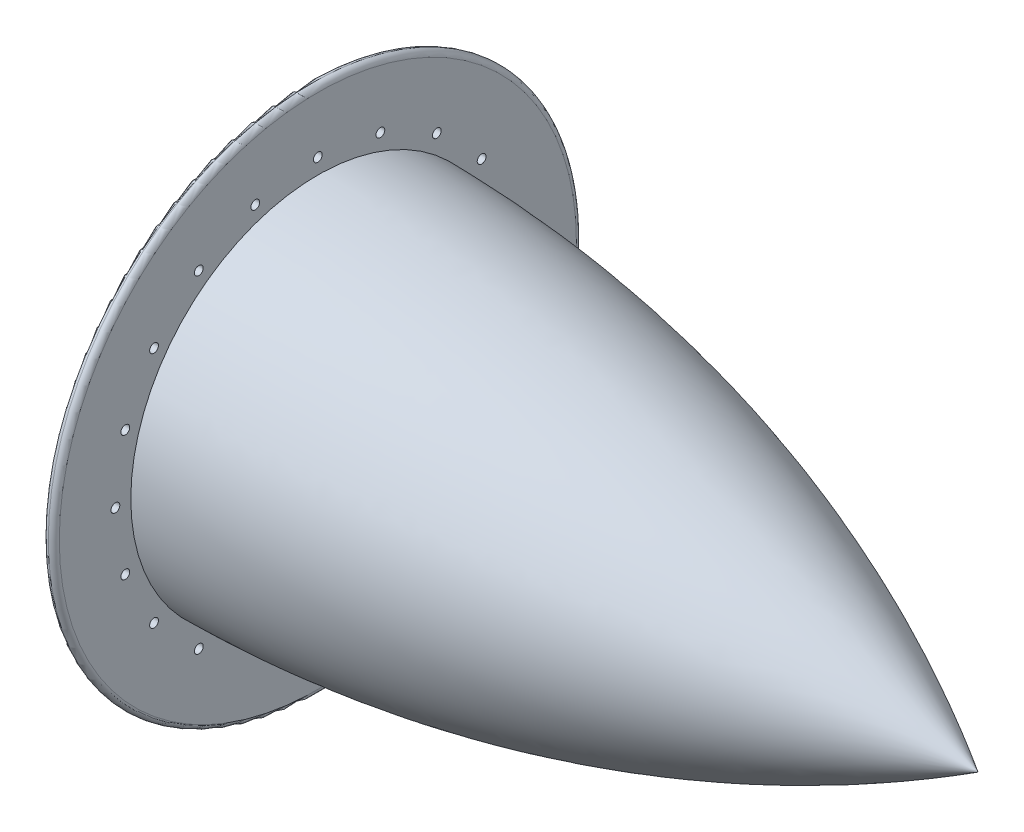
ISO-10303-21;
HEADER;
FILE_DESCRIPTION(('STEP AP214'),'2;1');
FILE_NAME('part.step','',(''),(''),'','','');
FILE_SCHEMA(('AUTOMOTIVE_DESIGN { 1 0 10303 214 1 1 1 1 }'));
ENDSEC;
DATA;
#1=APPLICATION_CONTEXT('core data for automotive mechanical design processes');
#2=APPLICATION_PROTOCOL_DEFINITION('international standard','automotive_design',2000,#1);
#3=PRODUCT_CONTEXT('',#1,'mechanical');
#4=PRODUCT('Part','Part','',(#3));
#5=PRODUCT_RELATED_PRODUCT_CATEGORY('part','',(#4));
#6=PRODUCT_DEFINITION_FORMATION('','',#4);
#7=PRODUCT_DEFINITION_CONTEXT('part definition',#1,'design');
#8=PRODUCT_DEFINITION('design','',#6,#7);
#9=PRODUCT_DEFINITION_SHAPE('','',#8);
#10=(LENGTH_UNIT() NAMED_UNIT(*) SI_UNIT(.MILLI.,.METRE.));
#11=(NAMED_UNIT(*) PLANE_ANGLE_UNIT() SI_UNIT($,.RADIAN.));
#12=(NAMED_UNIT(*) SI_UNIT($,.STERADIAN.) SOLID_ANGLE_UNIT());
#13=UNCERTAINTY_MEASURE_WITH_UNIT(LENGTH_MEASURE(1.E-05),#10,'distance_accuracy_value','');
#14=(GEOMETRIC_REPRESENTATION_CONTEXT(3) GLOBAL_UNCERTAINTY_ASSIGNED_CONTEXT((#13)) GLOBAL_UNIT_ASSIGNED_CONTEXT((#10,
#11,#12)) REPRESENTATION_CONTEXT('',''));
#15=CARTESIAN_POINT('',(0.,0.,0.));
#16=DIRECTION('',(0.,0.,1.));
#17=DIRECTION('',(1.,0.,0.));
#18=AXIS2_PLACEMENT_3D('',#15,#16,#17);
#19=CARTESIAN_POINT('',(-87.944407150557,0.,-509.152184354472));
#20=DIRECTION('',(0.,-1.,0.));
#21=DIRECTION('',(0.,0.,1.));
#22=AXIS2_PLACEMENT_3D('',#19,#20,#21);
#23=CIRCLE('',#22,589.18559934876);
#24=TRIMMED_CURVE('',#23,(PARAMETER_VALUE(-0.527312363931919)),
(PARAMETER_VALUE(0.527312363931919)),.T.,.PARAMETER.);
#25=CARTESIAN_POINT('',(-87.944407150557,0.,0.));
#26=DIRECTION('',(-1.,0.,0.));
#27=AXIS1_PLACEMENT('',#25,#26);
#28=SURFACE_OF_REVOLUTION('',#24,#27);
#29=CARTESIAN_POINT('',(-81.64295491679,0.,0.));
#30=DIRECTION('',(-1.,0.,0.));
#31=DIRECTION('',(0.,0.,1.));
#32=AXIS2_PLACEMENT_3D('',#29,#30,#31);
#33=CIRCLE('',#32,79.9997164145088);
#34=CARTESIAN_POINT('',(-81.64295491679,0.,79.9997164145088));
#35=VERTEX_POINT('',#34);
#36=EDGE_CURVE('E239',#35,#35,#33,.T.);
#37=ORIENTED_EDGE('',*,*,#36,.T.);
#38=EDGE_LOOP('',(#37));
#39=FACE_BOUND('',#38,.T.);
#40=CARTESIAN_POINT('',(208.541214165262,0.,0.));
#41=VERTEX_POINT('',#40);
#42=VERTEX_LOOP('',#41);
#43=FACE_BOUND('',#42,.T.);
#44=ADVANCED_FACE('F42',(#39,#43),#28,.F.);
#45=CARTESIAN_POINT('',(-86.64295491679,0.,0.));
#46=DIRECTION('',(-1.,0.,0.));
#47=DIRECTION('',(0.,0.,1.));
#48=AXIS2_PLACEMENT_3D('',#45,#46,#47);
#49=PLANE('',#48);
#50=CARTESIAN_POINT('',(-86.64295491679,0.,0.));
#51=DIRECTION('',(-1.,0.,0.));
#52=DIRECTION('',(0.,0.,1.));
#53=AXIS2_PLACEMENT_3D('',#50,#51,#52);
#54=CIRCLE('',#53,117.5);
#55=CARTESIAN_POINT('',(-86.64295491679,0.,117.5));
#56=VERTEX_POINT('',#55);
#57=EDGE_CURVE('E11',#56,#56,#54,.T.);
#58=ORIENTED_EDGE('',*,*,#57,.T.);
#59=EDGE_LOOP('',(#58));
#60=FACE_BOUND('',#59,.T.);
#61=CARTESIAN_POINT('',(-86.64295491679,92.,0.));
#62=DIRECTION('',(-1.,0.,0.));
#63=DIRECTION('',(0.,0.,1.));
#64=AXIS2_PLACEMENT_3D('',#61,#62,#63);
#65=CIRCLE('',#64,2.);
#66=CARTESIAN_POINT('',(-86.64295491679,92.,2.));
#67=VERTEX_POINT('',#66);
#68=EDGE_CURVE('E174',#67,#67,#65,.T.);
#69=ORIENTED_EDGE('',*,*,#68,.F.);
#70=EDGE_LOOP('',(#69));
#71=FACE_BOUND('',#70,.T.);
#72=CARTESIAN_POINT('',(-86.64295491679,87.4971994991545,-28.429563482494));
#73=DIRECTION('',(-1.,0.,0.));
#74=DIRECTION('',(0.,0.,1.));
#75=AXIS2_PLACEMENT_3D('',#72,#73,#74);
#76=CIRCLE('',#75,2.);
#77=CARTESIAN_POINT('',(-86.64295491679,87.4971994991545,-26.429563482494));
#78=VERTEX_POINT('',#77);
#79=EDGE_CURVE('E94',#78,#78,#76,.T.);
#80=ORIENTED_EDGE('',*,*,#79,.F.);
#81=EDGE_LOOP('',(#80));
#82=FACE_BOUND('',#81,.T.);
#83=CARTESIAN_POINT('',(-86.64295491679,74.4295634824959,-54.0762432109065));
#84=DIRECTION('',(-1.,0.,0.));
#85=DIRECTION('',(0.,0.,1.));
#86=AXIS2_PLACEMENT_3D('',#83,#84,#85);
#87=CIRCLE('',#86,2.);
#88=CARTESIAN_POINT('',(-86.64295491679,74.4295634824959,-52.0762432109065));
#89=VERTEX_POINT('',#88);
#90=EDGE_CURVE('E399',#89,#89,#87,.T.);
#91=ORIENTED_EDGE('',*,*,#90,.F.);
#92=EDGE_LOOP('',(#91));
#93=FACE_BOUND('',#92,.T.);
#94=CARTESIAN_POINT('',(-86.64295491679,54.0762432109084,-74.4295634824945));
#95=DIRECTION('',(-1.,0.,0.));
#96=DIRECTION('',(0.,0.,1.));
#97=AXIS2_PLACEMENT_3D('',#94,#95,#96);
#98=CIRCLE('',#97,2.);
#99=CARTESIAN_POINT('',(-86.64295491679,54.0762432109084,-72.4295634824945));
#100=VERTEX_POINT('',#99);
#101=EDGE_CURVE('E169',#100,#100,#98,.T.);
#102=ORIENTED_EDGE('',*,*,#101,.F.);
#103=EDGE_LOOP('',(#102));
#104=FACE_BOUND('',#103,.T.);
#105=CARTESIAN_POINT('',(-86.64295491679,87.4971994991541,28.4295634824952));
#106=DIRECTION('',(-1.,0.,0.));
#107=DIRECTION('',(0.,0.,1.));
#108=AXIS2_PLACEMENT_3D('',#105,#106,#107);
#109=CIRCLE('',#108,2.);
#110=CARTESIAN_POINT('',(-86.64295491679,87.4971994991541,30.4295634824952));
#111=VERTEX_POINT('',#110);
#112=EDGE_CURVE('E170',#111,#111,#109,.T.);
#113=ORIENTED_EDGE('',*,*,#112,.F.);
#114=EDGE_LOOP('',(#113));
#115=FACE_BOUND('',#114,.T.);
#116=CARTESIAN_POINT('',(-86.64295491679,74.4295634824951,54.0762432109076));
#117=DIRECTION('',(-1.,0.,0.));
#118=DIRECTION('',(0.,0.,1.));
#119=AXIS2_PLACEMENT_3D('',#116,#117,#118);
#120=CIRCLE('',#119,2.);
#121=CARTESIAN_POINT('',(-86.64295491679,74.4295634824951,56.0762432109076));
#122=VERTEX_POINT('',#121);
#123=EDGE_CURVE('E179',#122,#122,#120,.T.);
#124=ORIENTED_EDGE('',*,*,#123,.F.);
#125=EDGE_LOOP('',(#124));
#126=FACE_BOUND('',#125,.T.);
#127=CARTESIAN_POINT('',(-86.64295491679,54.0762432109074,74.4295634824953));
#128=DIRECTION('',(-1.,0.,0.));
#129=DIRECTION('',(0.,0.,1.));
#130=AXIS2_PLACEMENT_3D('',#127,#128,#129);
#131=CIRCLE('',#130,2.);
#132=CARTESIAN_POINT('',(-86.64295491679,54.0762432109074,76.4295634824953));
#133=VERTEX_POINT('',#132);
#134=EDGE_CURVE('E187',#133,#133,#131,.T.);
#135=ORIENTED_EDGE('',*,*,#134,.F.);
#136=EDGE_LOOP('',(#135));
#137=FACE_BOUND('',#136,.T.);
#138=CARTESIAN_POINT('',(-86.64295491679,28.4295634824949,87.4971994991542));
#139=DIRECTION('',(-1.,0.,0.));
#140=DIRECTION('',(0.,0.,1.));
#141=AXIS2_PLACEMENT_3D('',#138,#139,#140);
#142=CIRCLE('',#141,1.99999999999998);
#143=CARTESIAN_POINT('',(-86.64295491679,28.4295634824949,89.4971994991542));
#144=VERTEX_POINT('',#143);
#145=EDGE_CURVE('E195',#144,#144,#142,.T.);
#146=ORIENTED_EDGE('',*,*,#145,.F.);
#147=EDGE_LOOP('',(#146));
#148=FACE_BOUND('',#147,.T.);
#149=CARTESIAN_POINT('',(-86.64295491679,-3.21216283173568E-13,92.));
#150=DIRECTION('',(-1.,0.,0.));
#151=DIRECTION('',(0.,0.,1.));
#152=AXIS2_PLACEMENT_3D('',#149,#150,#151);
#153=CIRCLE('',#152,2.);
#154=CARTESIAN_POINT('',(-86.64295491679,-3.21216283173568E-13,94.));
#155=VERTEX_POINT('',#154);
#156=EDGE_CURVE('E203',#155,#155,#153,.T.);
#157=ORIENTED_EDGE('',*,*,#156,.F.);
#158=EDGE_LOOP('',(#157));
#159=FACE_BOUND('',#158,.T.);
#160=CARTESIAN_POINT('',(-86.64295491679,-28.4295634824955,87.497199499154));
#161=DIRECTION('',(-1.,0.,0.));
#162=DIRECTION('',(0.,0.,1.));
#163=AXIS2_PLACEMENT_3D('',#160,#161,#162);
#164=CIRCLE('',#163,2.);
#165=CARTESIAN_POINT('',(-86.64295491679,-28.4295634824955,89.497199499154));
#166=VERTEX_POINT('',#165);
#167=EDGE_CURVE('E211',#166,#166,#164,.T.);
#168=ORIENTED_EDGE('',*,*,#167,.F.);
#169=EDGE_LOOP('',(#168));
#170=FACE_BOUND('',#169,.T.);
#171=CARTESIAN_POINT('',(-86.64295491679,-54.0762432109079,74.4295634824949));
#172=DIRECTION('',(-1.,0.,0.));
#173=DIRECTION('',(0.,0.,1.));
#174=AXIS2_PLACEMENT_3D('',#171,#172,#173);
#175=CIRCLE('',#174,2.);
#176=CARTESIAN_POINT('',(-86.64295491679,-54.0762432109079,76.4295634824949));
#177=VERTEX_POINT('',#176);
#178=EDGE_CURVE('E219',#177,#177,#175,.T.);
#179=ORIENTED_EDGE('',*,*,#178,.F.);
#180=EDGE_LOOP('',(#179));
#181=FACE_BOUND('',#180,.T.);
#182=CARTESIAN_POINT('',(-86.64295491679,-74.4295634824955,54.0762432109071));
#183=DIRECTION('',(-1.,0.,0.));
#184=DIRECTION('',(0.,0.,1.));
#185=AXIS2_PLACEMENT_3D('',#182,#183,#184);
#186=CIRCLE('',#185,2.00000000000001);
#187=CARTESIAN_POINT('',(-86.64295491679,-74.4295634824955,56.0762432109071));
#188=VERTEX_POINT('',#187);
#189=EDGE_CURVE('E227',#188,#188,#186,.T.);
#190=ORIENTED_EDGE('',*,*,#189,.F.);
#191=EDGE_LOOP('',(#190));
#192=FACE_BOUND('',#191,.T.);
#193=CARTESIAN_POINT('',(-86.64295491679,-87.4971994991543,28.4295634824946));
#194=DIRECTION('',(-1.,0.,0.));
#195=DIRECTION('',(0.,0.,1.));
#196=AXIS2_PLACEMENT_3D('',#193,#194,#195);
#197=CIRCLE('',#196,2.00000000000001);
#198=CARTESIAN_POINT('',(-86.64295491679,-87.4971994991543,30.4295634824946));
#199=VERTEX_POINT('',#198);
#200=EDGE_CURVE('E104',#199,#199,#197,.T.);
#201=ORIENTED_EDGE('',*,*,#200,.F.);
#202=EDGE_LOOP('',(#201));
#203=FACE_BOUND('',#202,.T.);
#204=CARTESIAN_POINT('',(-86.64295491679,-92.,-6.42432566347136E-13));
#205=DIRECTION('',(-1.,0.,0.));
#206=DIRECTION('',(0.,0.,1.));
#207=AXIS2_PLACEMENT_3D('',#204,#205,#206);
#208=CIRCLE('',#207,2.);
#209=CARTESIAN_POINT('',(-86.64295491679,-92.,1.99999999999936));
#210=VERTEX_POINT('',#209);
#211=EDGE_CURVE('E113',#210,#210,#208,.T.);
#212=ORIENTED_EDGE('',*,*,#211,.F.);
#213=EDGE_LOOP('',(#212));
#214=FACE_BOUND('',#213,.T.);
#215=CARTESIAN_POINT('',(-86.64295491679,-87.4971994991539,-28.4295634824959));
#216=DIRECTION('',(-1.,0.,0.));
#217=DIRECTION('',(0.,0.,1.));
#218=AXIS2_PLACEMENT_3D('',#215,#216,#217);
#219=CIRCLE('',#218,2.);
#220=CARTESIAN_POINT('',(-86.64295491679,-87.4971994991539,-26.4295634824959));
#221=VERTEX_POINT('',#220);
#222=EDGE_CURVE('E121',#221,#221,#219,.T.);
#223=ORIENTED_EDGE('',*,*,#222,.F.);
#224=EDGE_LOOP('',(#223));
#225=FACE_BOUND('',#224,.T.);
#226=CARTESIAN_POINT('',(-86.64295491679,-74.4295634824947,-54.0762432109082));
#227=DIRECTION('',(-1.,0.,0.));
#228=DIRECTION('',(0.,0.,1.));
#229=AXIS2_PLACEMENT_3D('',#226,#227,#228);
#230=CIRCLE('',#229,2.);
#231=CARTESIAN_POINT('',(-86.64295491679,-74.4295634824947,-52.0762432109082));
#232=VERTEX_POINT('',#231);
#233=EDGE_CURVE('E129',#232,#232,#230,.T.);
#234=ORIENTED_EDGE('',*,*,#233,.F.);
#235=EDGE_LOOP('',(#234));
#236=FACE_BOUND('',#235,.T.);
#237=CARTESIAN_POINT('',(-86.64295491679,-54.0762432109068,-74.4295634824957));
#238=DIRECTION('',(-1.,0.,0.));
#239=DIRECTION('',(0.,0.,1.));
#240=AXIS2_PLACEMENT_3D('',#237,#238,#239);
#241=CIRCLE('',#240,2.);
#242=CARTESIAN_POINT('',(-86.64295491679,-54.0762432109068,-72.4295634824957));
#243=VERTEX_POINT('',#242);
#244=EDGE_CURVE('E137',#243,#243,#241,.T.);
#245=ORIENTED_EDGE('',*,*,#244,.F.);
#246=EDGE_LOOP('',(#245));
#247=FACE_BOUND('',#246,.T.);
#248=CARTESIAN_POINT('',(-86.64295491679,-28.4295634824943,-87.4971994991544));
#249=DIRECTION('',(-1.,0.,0.));
#250=DIRECTION('',(0.,0.,1.));
#251=AXIS2_PLACEMENT_3D('',#248,#249,#250);
#252=CIRCLE('',#251,2.00000000000001);
#253=CARTESIAN_POINT('',(-86.64295491679,-28.4295634824943,-85.4971994991544));
#254=VERTEX_POINT('',#253);
#255=EDGE_CURVE('E145',#254,#254,#252,.T.);
#256=ORIENTED_EDGE('',*,*,#255,.F.);
#257=EDGE_LOOP('',(#256));
#258=FACE_BOUND('',#257,.T.);
#259=CARTESIAN_POINT('',(-86.64295491679,9.63648849520705E-13,-92.));
#260=DIRECTION('',(-1.,0.,0.));
#261=DIRECTION('',(0.,0.,1.));
#262=AXIS2_PLACEMENT_3D('',#259,#260,#261);
#263=CIRCLE('',#262,2.);
#264=CARTESIAN_POINT('',(-86.64295491679,9.63648849520705E-13,-90.));
#265=VERTEX_POINT('',#264);
#266=EDGE_CURVE('E153',#265,#265,#263,.T.);
#267=ORIENTED_EDGE('',*,*,#266,.F.);
#268=EDGE_LOOP('',(#267));
#269=FACE_BOUND('',#268,.T.);
#270=CARTESIAN_POINT('',(-86.64295491679,28.4295634824962,-87.4971994991538));
#271=DIRECTION('',(-1.,0.,0.));
#272=DIRECTION('',(0.,0.,1.));
#273=AXIS2_PLACEMENT_3D('',#270,#271,#272);
#274=CIRCLE('',#273,2.);
#275=CARTESIAN_POINT('',(-86.64295491679,28.4295634824962,-85.4971994991538));
#276=VERTEX_POINT('',#275);
#277=EDGE_CURVE('E161',#276,#276,#274,.T.);
#278=ORIENTED_EDGE('',*,*,#277,.F.);
#279=EDGE_LOOP('',(#278));
#280=FACE_BOUND('',#279,.T.);
#281=CARTESIAN_POINT('',(-86.64295491679,0.,0.));
#282=DIRECTION('',(-1.,0.,0.));
#283=DIRECTION('',(0.,0.,1.));
#284=AXIS2_PLACEMENT_3D('',#281,#282,#283);
#285=CIRCLE('',#284,79.9997164145088);
#286=CARTESIAN_POINT('',(-86.64295491679,0.,79.9997164145088));
#287=VERTEX_POINT('',#286);
#288=EDGE_CURVE('E234',#287,#287,#285,.T.);
#289=ORIENTED_EDGE('',*,*,#288,.F.);
#290=EDGE_LOOP('',(#289));
#291=FACE_BOUND('',#290,.T.);
#292=ADVANCED_FACE('F59',(#60,#71,#82,#93,#104,#115,#126,#137,#148,#159,#170,#181,#192,#203,
#214,#225,#236,#247,#258,#269,#280,#291),#49,.T.);
#293=CARTESIAN_POINT('',(-81.64295491679,0.,0.));
#294=DIRECTION('',(-1.,0.,0.));
#295=DIRECTION('',(0.,0.,1.));
#296=AXIS2_PLACEMENT_3D('',#293,#294,#295);
#297=PLANE('',#296);
#298=CARTESIAN_POINT('',(-81.64295491679,0.,0.));
#299=DIRECTION('',(-1.,0.,0.));
#300=DIRECTION('',(0.,0.,1.));
#301=AXIS2_PLACEMENT_3D('',#298,#299,#300);
#302=CIRCLE('',#301,117.5);
#303=CARTESIAN_POINT('',(-81.64295491679,0.,117.5));
#304=VERTEX_POINT('',#303);
#305=EDGE_CURVE('E52',#304,#304,#302,.F.);
#306=ORIENTED_EDGE('',*,*,#305,.T.);
#307=EDGE_LOOP('',(#306));
#308=FACE_BOUND('',#307,.T.);
#309=CARTESIAN_POINT('',(-81.64295491679,92.,0.));
#310=DIRECTION('',(-1.,0.,0.));
#311=DIRECTION('',(0.,0.,1.));
#312=AXIS2_PLACEMENT_3D('',#309,#310,#311);
#313=CIRCLE('',#312,2.);
#314=CARTESIAN_POINT('',(-81.64295491679,92.,2.));
#315=VERTEX_POINT('',#314);
#316=EDGE_CURVE('E242',#315,#315,#313,.T.);
#317=ORIENTED_EDGE('',*,*,#316,.T.);
#318=EDGE_LOOP('',(#317));
#319=FACE_BOUND('',#318,.T.);
#320=CARTESIAN_POINT('',(-81.64295491679,87.4971994991545,-28.429563482494));
#321=DIRECTION('',(-1.,0.,0.));
#322=DIRECTION('',(0.,0.,1.));
#323=AXIS2_PLACEMENT_3D('',#320,#321,#322);
#324=CIRCLE('',#323,2.);
#325=CARTESIAN_POINT('',(-81.64295491679,87.4971994991545,-26.429563482494));
#326=VERTEX_POINT('',#325);
#327=EDGE_CURVE('E91',#326,#326,#324,.T.);
#328=ORIENTED_EDGE('',*,*,#327,.T.);
#329=EDGE_LOOP('',(#328));
#330=FACE_BOUND('',#329,.T.);
#331=CARTESIAN_POINT('',(-81.64295491679,74.4295634824959,-54.0762432109065));
#332=DIRECTION('',(-1.,0.,0.));
#333=DIRECTION('',(0.,0.,1.));
#334=AXIS2_PLACEMENT_3D('',#331,#332,#333);
#335=CIRCLE('',#334,2.);
#336=CARTESIAN_POINT('',(-81.64295491679,74.4295634824959,-52.0762432109065));
#337=VERTEX_POINT('',#336);
#338=EDGE_CURVE('E100',#337,#337,#335,.T.);
#339=ORIENTED_EDGE('',*,*,#338,.T.);
#340=EDGE_LOOP('',(#339));
#341=FACE_BOUND('',#340,.T.);
#342=CARTESIAN_POINT('',(-81.64295491679,54.0762432109084,-74.4295634824945));
#343=DIRECTION('',(-1.,0.,0.));
#344=DIRECTION('',(0.,0.,1.));
#345=AXIS2_PLACEMENT_3D('',#342,#343,#344);
#346=CIRCLE('',#345,2.);
#347=CARTESIAN_POINT('',(-81.64295491679,54.0762432109084,-72.4295634824945));
#348=VERTEX_POINT('',#347);
#349=EDGE_CURVE('E259',#348,#348,#346,.T.);
#350=ORIENTED_EDGE('',*,*,#349,.T.);
#351=EDGE_LOOP('',(#350));
#352=FACE_BOUND('',#351,.T.);
#353=CARTESIAN_POINT('',(-81.64295491679,87.4971994991541,28.4295634824952));
#354=DIRECTION('',(-1.,0.,0.));
#355=DIRECTION('',(0.,0.,1.));
#356=AXIS2_PLACEMENT_3D('',#353,#354,#355);
#357=CIRCLE('',#356,2.);
#358=CARTESIAN_POINT('',(-81.64295491679,87.4971994991541,30.4295634824952));
#359=VERTEX_POINT('',#358);
#360=EDGE_CURVE('E175',#359,#359,#357,.T.);
#361=ORIENTED_EDGE('',*,*,#360,.T.);
#362=EDGE_LOOP('',(#361));
#363=FACE_BOUND('',#362,.T.);
#364=CARTESIAN_POINT('',(-81.64295491679,74.4295634824951,54.0762432109076));
#365=DIRECTION('',(-1.,0.,0.));
#366=DIRECTION('',(0.,0.,1.));
#367=AXIS2_PLACEMENT_3D('',#364,#365,#366);
#368=CIRCLE('',#367,2.);
#369=CARTESIAN_POINT('',(-81.64295491679,74.4295634824951,56.0762432109076));
#370=VERTEX_POINT('',#369);
#371=EDGE_CURVE('E183',#370,#370,#368,.T.);
#372=ORIENTED_EDGE('',*,*,#371,.T.);
#373=EDGE_LOOP('',(#372));
#374=FACE_BOUND('',#373,.T.);
#375=CARTESIAN_POINT('',(-81.64295491679,54.0762432109074,74.4295634824953));
#376=DIRECTION('',(-1.,0.,0.));
#377=DIRECTION('',(0.,0.,1.));
#378=AXIS2_PLACEMENT_3D('',#375,#376,#377);
#379=CIRCLE('',#378,2.);
#380=CARTESIAN_POINT('',(-81.64295491679,54.0762432109074,76.4295634824953));
#381=VERTEX_POINT('',#380);
#382=EDGE_CURVE('E191',#381,#381,#379,.T.);
#383=ORIENTED_EDGE('',*,*,#382,.T.);
#384=EDGE_LOOP('',(#383));
#385=FACE_BOUND('',#384,.T.);
#386=CARTESIAN_POINT('',(-81.64295491679,28.4295634824949,87.4971994991542));
#387=DIRECTION('',(-1.,0.,0.));
#388=DIRECTION('',(0.,0.,1.));
#389=AXIS2_PLACEMENT_3D('',#386,#387,#388);
#390=CIRCLE('',#389,1.99999999999998);
#391=CARTESIAN_POINT('',(-81.64295491679,28.4295634824949,89.4971994991542));
#392=VERTEX_POINT('',#391);
#393=EDGE_CURVE('E199',#392,#392,#390,.T.);
#394=ORIENTED_EDGE('',*,*,#393,.T.);
#395=EDGE_LOOP('',(#394));
#396=FACE_BOUND('',#395,.T.);
#397=CARTESIAN_POINT('',(-81.64295491679,-3.21216283173568E-13,92.));
#398=DIRECTION('',(-1.,0.,0.));
#399=DIRECTION('',(0.,0.,1.));
#400=AXIS2_PLACEMENT_3D('',#397,#398,#399);
#401=CIRCLE('',#400,2.);
#402=CARTESIAN_POINT('',(-81.64295491679,-3.21216283173568E-13,94.));
#403=VERTEX_POINT('',#402);
#404=EDGE_CURVE('E207',#403,#403,#401,.T.);
#405=ORIENTED_EDGE('',*,*,#404,.T.);
#406=EDGE_LOOP('',(#405));
#407=FACE_BOUND('',#406,.T.);
#408=CARTESIAN_POINT('',(-81.64295491679,-28.4295634824955,87.497199499154));
#409=DIRECTION('',(-1.,0.,0.));
#410=DIRECTION('',(0.,0.,1.));
#411=AXIS2_PLACEMENT_3D('',#408,#409,#410);
#412=CIRCLE('',#411,2.);
#413=CARTESIAN_POINT('',(-81.64295491679,-28.4295634824955,89.497199499154));
#414=VERTEX_POINT('',#413);
#415=EDGE_CURVE('E215',#414,#414,#412,.T.);
#416=ORIENTED_EDGE('',*,*,#415,.T.);
#417=EDGE_LOOP('',(#416));
#418=FACE_BOUND('',#417,.T.);
#419=CARTESIAN_POINT('',(-81.64295491679,-54.0762432109079,74.4295634824949));
#420=DIRECTION('',(-1.,0.,0.));
#421=DIRECTION('',(0.,0.,1.));
#422=AXIS2_PLACEMENT_3D('',#419,#420,#421);
#423=CIRCLE('',#422,2.);
#424=CARTESIAN_POINT('',(-81.64295491679,-54.0762432109079,76.4295634824949));
#425=VERTEX_POINT('',#424);
#426=EDGE_CURVE('E223',#425,#425,#423,.T.);
#427=ORIENTED_EDGE('',*,*,#426,.T.);
#428=EDGE_LOOP('',(#427));
#429=FACE_BOUND('',#428,.T.);
#430=CARTESIAN_POINT('',(-81.64295491679,-74.4295634824955,54.0762432109071));
#431=DIRECTION('',(-1.,0.,0.));
#432=DIRECTION('',(0.,0.,1.));
#433=AXIS2_PLACEMENT_3D('',#430,#431,#432);
#434=CIRCLE('',#433,2.00000000000001);
#435=CARTESIAN_POINT('',(-81.64295491679,-74.4295634824955,56.0762432109071));
#436=VERTEX_POINT('',#435);
#437=EDGE_CURVE('E108',#436,#436,#434,.T.);
#438=ORIENTED_EDGE('',*,*,#437,.T.);
#439=EDGE_LOOP('',(#438));
#440=FACE_BOUND('',#439,.T.);
#441=CARTESIAN_POINT('',(-81.64295491679,-87.4971994991543,28.4295634824946));
#442=DIRECTION('',(-1.,0.,0.));
#443=DIRECTION('',(0.,0.,1.));
#444=AXIS2_PLACEMENT_3D('',#441,#442,#443);
#445=CIRCLE('',#444,2.00000000000001);
#446=CARTESIAN_POINT('',(-81.64295491679,-87.4971994991543,30.4295634824946));
#447=VERTEX_POINT('',#446);
#448=EDGE_CURVE('E109',#447,#447,#445,.T.);
#449=ORIENTED_EDGE('',*,*,#448,.T.);
#450=EDGE_LOOP('',(#449));
#451=FACE_BOUND('',#450,.T.);
#452=CARTESIAN_POINT('',(-81.64295491679,-92.,-6.42432566347136E-13));
#453=DIRECTION('',(-1.,0.,0.));
#454=DIRECTION('',(0.,0.,1.));
#455=AXIS2_PLACEMENT_3D('',#452,#453,#454);
#456=CIRCLE('',#455,2.);
#457=CARTESIAN_POINT('',(-81.64295491679,-92.,1.99999999999936));
#458=VERTEX_POINT('',#457);
#459=EDGE_CURVE('E117',#458,#458,#456,.T.);
#460=ORIENTED_EDGE('',*,*,#459,.T.);
#461=EDGE_LOOP('',(#460));
#462=FACE_BOUND('',#461,.T.);
#463=CARTESIAN_POINT('',(-81.64295491679,-87.4971994991539,-28.4295634824959));
#464=DIRECTION('',(-1.,0.,0.));
#465=DIRECTION('',(0.,0.,1.));
#466=AXIS2_PLACEMENT_3D('',#463,#464,#465);
#467=CIRCLE('',#466,2.);
#468=CARTESIAN_POINT('',(-81.64295491679,-87.4971994991539,-26.4295634824959));
#469=VERTEX_POINT('',#468);
#470=EDGE_CURVE('E125',#469,#469,#467,.T.);
#471=ORIENTED_EDGE('',*,*,#470,.T.);
#472=EDGE_LOOP('',(#471));
#473=FACE_BOUND('',#472,.T.);
#474=CARTESIAN_POINT('',(-81.64295491679,-74.4295634824947,-54.0762432109082));
#475=DIRECTION('',(-1.,0.,0.));
#476=DIRECTION('',(0.,0.,1.));
#477=AXIS2_PLACEMENT_3D('',#474,#475,#476);
#478=CIRCLE('',#477,2.);
#479=CARTESIAN_POINT('',(-81.64295491679,-74.4295634824947,-52.0762432109082));
#480=VERTEX_POINT('',#479);
#481=EDGE_CURVE('E133',#480,#480,#478,.T.);
#482=ORIENTED_EDGE('',*,*,#481,.T.);
#483=EDGE_LOOP('',(#482));
#484=FACE_BOUND('',#483,.T.);
#485=CARTESIAN_POINT('',(-81.64295491679,-54.0762432109068,-74.4295634824957));
#486=DIRECTION('',(-1.,0.,0.));
#487=DIRECTION('',(0.,0.,1.));
#488=AXIS2_PLACEMENT_3D('',#485,#486,#487);
#489=CIRCLE('',#488,2.);
#490=CARTESIAN_POINT('',(-81.64295491679,-54.0762432109068,-72.4295634824957));
#491=VERTEX_POINT('',#490);
#492=EDGE_CURVE('E141',#491,#491,#489,.T.);
#493=ORIENTED_EDGE('',*,*,#492,.T.);
#494=EDGE_LOOP('',(#493));
#495=FACE_BOUND('',#494,.T.);
#496=CARTESIAN_POINT('',(-81.64295491679,-28.4295634824943,-87.4971994991544));
#497=DIRECTION('',(-1.,0.,0.));
#498=DIRECTION('',(0.,0.,1.));
#499=AXIS2_PLACEMENT_3D('',#496,#497,#498);
#500=CIRCLE('',#499,2.00000000000001);
#501=CARTESIAN_POINT('',(-81.64295491679,-28.4295634824943,-85.4971994991544));
#502=VERTEX_POINT('',#501);
#503=EDGE_CURVE('E149',#502,#502,#500,.T.);
#504=ORIENTED_EDGE('',*,*,#503,.T.);
#505=EDGE_LOOP('',(#504));
#506=FACE_BOUND('',#505,.T.);
#507=CARTESIAN_POINT('',(-81.64295491679,9.63648849520705E-13,-92.));
#508=DIRECTION('',(-1.,0.,0.));
#509=DIRECTION('',(0.,0.,1.));
#510=AXIS2_PLACEMENT_3D('',#507,#508,#509);
#511=CIRCLE('',#510,2.);
#512=CARTESIAN_POINT('',(-81.64295491679,9.63648849520705E-13,-90.));
#513=VERTEX_POINT('',#512);
#514=EDGE_CURVE('E157',#513,#513,#511,.T.);
#515=ORIENTED_EDGE('',*,*,#514,.T.);
#516=EDGE_LOOP('',(#515));
#517=FACE_BOUND('',#516,.T.);
#518=CARTESIAN_POINT('',(-81.64295491679,28.4295634824962,-87.4971994991538));
#519=DIRECTION('',(-1.,0.,0.));
#520=DIRECTION('',(0.,0.,1.));
#521=AXIS2_PLACEMENT_3D('',#518,#519,#520);
#522=CIRCLE('',#521,2.);
#523=CARTESIAN_POINT('',(-81.64295491679,28.4295634824962,-85.4971994991538));
#524=VERTEX_POINT('',#523);
#525=EDGE_CURVE('E165',#524,#524,#522,.T.);
#526=ORIENTED_EDGE('',*,*,#525,.T.);
#527=EDGE_LOOP('',(#526));
#528=FACE_BOUND('',#527,.T.);
#529=CARTESIAN_POINT('',(-81.64295491679,0.,0.));
#530=DIRECTION('',(-1.,0.,0.));
#531=DIRECTION('',(0.,0.,1.));
#532=AXIS2_PLACEMENT_3D('',#529,#530,#531);
#533=CIRCLE('',#532,85.);
#534=CARTESIAN_POINT('',(-81.64295491679,0.,85.));
#535=VERTEX_POINT('',#534);
#536=EDGE_CURVE('E238',#535,#535,#533,.T.);
#537=ORIENTED_EDGE('',*,*,#536,.T.);
#538=EDGE_LOOP('',(#537));
#539=FACE_BOUND('',#538,.T.);
#540=ADVANCED_FACE('F65',(#308,#319,#330,#341,#352,#363,#374,#385,#396,#407,#418,#429,#440,#451,
#462,#473,#484,#495,#506,#517,#528,#539),#297,.F.);
#541=CARTESIAN_POINT('',(-86.64295491679,0.,0.));
#542=DIRECTION('',(1.,0.,0.));
#543=DIRECTION('',(0.,0.,-1.));
#544=AXIS2_PLACEMENT_3D('',#541,#542,#543);
#545=CYLINDRICAL_SURFACE('',#544,79.9997164145088);
#546=ORIENTED_EDGE('',*,*,#288,.T.);
#547=EDGE_LOOP('',(#546));
#548=FACE_BOUND('',#547,.T.);
#549=ORIENTED_EDGE('',*,*,#36,.F.);
#550=EDGE_LOOP('',(#549));
#551=FACE_BOUND('',#550,.T.);
#552=ADVANCED_FACE('F74',(#548,#551),#545,.F.);
#553=CARTESIAN_POINT('',(-87.944407150557,0.,-509.152184354472));
#554=DIRECTION('',(0.,-1.,0.));
#555=DIRECTION('',(0.,0.,1.));
#556=AXIS2_PLACEMENT_3D('',#553,#554,#555);
#557=CIRCLE('',#556,594.18559934876);
#558=TRIMMED_CURVE('',#557,(PARAMETER_VALUE(-0.541588648206733)),
(PARAMETER_VALUE(0.541588648206733)),.T.,.PARAMETER.);
#559=CARTESIAN_POINT('',(-87.944407150557,0.,0.));
#560=DIRECTION('',(-1.,0.,0.));
#561=AXIS1_PLACEMENT('',#559,#560);
#562=SURFACE_OF_REVOLUTION('',#558,#561);
#563=ORIENTED_EDGE('',*,*,#536,.F.);
#564=EDGE_LOOP('',(#563));
#565=FACE_BOUND('',#564,.T.);
#566=CARTESIAN_POINT('',(218.35704508321,0.,0.));
#567=VERTEX_POINT('',#566);
#568=VERTEX_LOOP('',#567);
#569=FACE_BOUND('',#568,.T.);
#570=ADVANCED_FACE('F71',(#565,#569),#562,.T.);
#571=CARTESIAN_POINT('',(-81.64295491679,28.4295634824962,-87.4971994991538));
#572=DIRECTION('',(-1.,0.,0.));
#573=DIRECTION('',(0.,0.,1.));
#574=AXIS2_PLACEMENT_3D('',#571,#572,#573);
#575=CYLINDRICAL_SURFACE('',#574,2.);
#576=ORIENTED_EDGE('',*,*,#525,.F.);
#577=EDGE_LOOP('',(#576));
#578=FACE_BOUND('',#577,.T.);
#579=ORIENTED_EDGE('',*,*,#277,.T.);
#580=EDGE_LOOP('',(#579));
#581=FACE_BOUND('',#580,.T.);
#582=ADVANCED_FACE('F73',(#578,#581),#575,.F.);
#583=CARTESIAN_POINT('',(-81.64295491679,9.63648849520705E-13,-92.));
#584=DIRECTION('',(-1.,0.,0.));
#585=DIRECTION('',(0.,0.,1.));
#586=AXIS2_PLACEMENT_3D('',#583,#584,#585);
#587=CYLINDRICAL_SURFACE('',#586,2.);
#588=ORIENTED_EDGE('',*,*,#514,.F.);
#589=EDGE_LOOP('',(#588));
#590=FACE_BOUND('',#589,.T.);
#591=ORIENTED_EDGE('',*,*,#266,.T.);
#592=EDGE_LOOP('',(#591));
#593=FACE_BOUND('',#592,.T.);
#594=ADVANCED_FACE('F296',(#590,#593),#587,.F.);
#595=CARTESIAN_POINT('',(-81.64295491679,-28.4295634824943,-87.4971994991544));
#596=DIRECTION('',(-1.,0.,0.));
#597=DIRECTION('',(0.,0.,1.));
#598=AXIS2_PLACEMENT_3D('',#595,#596,#597);
#599=CYLINDRICAL_SURFACE('',#598,2.00000000000001);
#600=ORIENTED_EDGE('',*,*,#503,.F.);
#601=EDGE_LOOP('',(#600));
#602=FACE_BOUND('',#601,.T.);
#603=ORIENTED_EDGE('',*,*,#255,.T.);
#604=EDGE_LOOP('',(#603));
#605=FACE_BOUND('',#604,.T.);
#606=ADVANCED_FACE('F346',(#602,#605),#599,.F.);
#607=CARTESIAN_POINT('',(-81.64295491679,-54.0762432109068,-74.4295634824957));
#608=DIRECTION('',(-1.,0.,0.));
#609=DIRECTION('',(0.,0.,1.));
#610=AXIS2_PLACEMENT_3D('',#607,#608,#609);
#611=CYLINDRICAL_SURFACE('',#610,2.);
#612=ORIENTED_EDGE('',*,*,#492,.F.);
#613=EDGE_LOOP('',(#612));
#614=FACE_BOUND('',#613,.T.);
#615=ORIENTED_EDGE('',*,*,#244,.T.);
#616=EDGE_LOOP('',(#615));
#617=FACE_BOUND('',#616,.T.);
#618=ADVANCED_FACE('F350',(#614,#617),#611,.F.);
#619=CARTESIAN_POINT('',(-81.64295491679,-74.4295634824947,-54.0762432109082));
#620=DIRECTION('',(-1.,0.,0.));
#621=DIRECTION('',(0.,0.,1.));
#622=AXIS2_PLACEMENT_3D('',#619,#620,#621);
#623=CYLINDRICAL_SURFACE('',#622,2.);
#624=ORIENTED_EDGE('',*,*,#481,.F.);
#625=EDGE_LOOP('',(#624));
#626=FACE_BOUND('',#625,.T.);
#627=ORIENTED_EDGE('',*,*,#233,.T.);
#628=EDGE_LOOP('',(#627));
#629=FACE_BOUND('',#628,.T.);
#630=ADVANCED_FACE('F354',(#626,#629),#623,.F.);
#631=CARTESIAN_POINT('',(-81.64295491679,-87.4971994991539,-28.4295634824959));
#632=DIRECTION('',(-1.,0.,0.));
#633=DIRECTION('',(0.,0.,1.));
#634=AXIS2_PLACEMENT_3D('',#631,#632,#633);
#635=CYLINDRICAL_SURFACE('',#634,2.);
#636=ORIENTED_EDGE('',*,*,#470,.F.);
#637=EDGE_LOOP('',(#636));
#638=FACE_BOUND('',#637,.T.);
#639=ORIENTED_EDGE('',*,*,#222,.T.);
#640=EDGE_LOOP('',(#639));
#641=FACE_BOUND('',#640,.T.);
#642=ADVANCED_FACE('F358',(#638,#641),#635,.F.);
#643=CARTESIAN_POINT('',(-81.64295491679,-92.,-6.42432566347136E-13));
#644=DIRECTION('',(-1.,0.,0.));
#645=DIRECTION('',(0.,0.,1.));
#646=AXIS2_PLACEMENT_3D('',#643,#644,#645);
#647=CYLINDRICAL_SURFACE('',#646,2.);
#648=ORIENTED_EDGE('',*,*,#459,.F.);
#649=EDGE_LOOP('',(#648));
#650=FACE_BOUND('',#649,.T.);
#651=ORIENTED_EDGE('',*,*,#211,.T.);
#652=EDGE_LOOP('',(#651));
#653=FACE_BOUND('',#652,.T.);
#654=ADVANCED_FACE('F362',(#650,#653),#647,.F.);
#655=CARTESIAN_POINT('',(-81.64295491679,-87.4971994991543,28.4295634824946));
#656=DIRECTION('',(-1.,0.,0.));
#657=DIRECTION('',(0.,0.,1.));
#658=AXIS2_PLACEMENT_3D('',#655,#656,#657);
#659=CYLINDRICAL_SURFACE('',#658,2.00000000000001);
#660=ORIENTED_EDGE('',*,*,#448,.F.);
#661=EDGE_LOOP('',(#660));
#662=FACE_BOUND('',#661,.T.);
#663=ORIENTED_EDGE('',*,*,#200,.T.);
#664=EDGE_LOOP('',(#663));
#665=FACE_BOUND('',#664,.T.);
#666=ADVANCED_FACE('F314',(#662,#665),#659,.F.);
#667=CARTESIAN_POINT('',(-81.64295491679,-74.4295634824955,54.0762432109071));
#668=DIRECTION('',(-1.,0.,0.));
#669=DIRECTION('',(0.,0.,1.));
#670=AXIS2_PLACEMENT_3D('',#667,#668,#669);
#671=CYLINDRICAL_SURFACE('',#670,2.00000000000001);
#672=ORIENTED_EDGE('',*,*,#437,.F.);
#673=EDGE_LOOP('',(#672));
#674=FACE_BOUND('',#673,.T.);
#675=ORIENTED_EDGE('',*,*,#189,.T.);
#676=EDGE_LOOP('',(#675));
#677=FACE_BOUND('',#676,.T.);
#678=ADVANCED_FACE('F310',(#674,#677),#671,.F.);
#679=CARTESIAN_POINT('',(-81.64295491679,-54.0762432109079,74.4295634824949));
#680=DIRECTION('',(-1.,0.,0.));
#681=DIRECTION('',(0.,0.,1.));
#682=AXIS2_PLACEMENT_3D('',#679,#680,#681);
#683=CYLINDRICAL_SURFACE('',#682,2.);
#684=ORIENTED_EDGE('',*,*,#426,.F.);
#685=EDGE_LOOP('',(#684));
#686=FACE_BOUND('',#685,.T.);
#687=ORIENTED_EDGE('',*,*,#178,.T.);
#688=EDGE_LOOP('',(#687));
#689=FACE_BOUND('',#688,.T.);
#690=ADVANCED_FACE('F313',(#686,#689),#683,.F.);
#691=CARTESIAN_POINT('',(-81.64295491679,-28.4295634824955,87.497199499154));
#692=DIRECTION('',(-1.,0.,0.));
#693=DIRECTION('',(0.,0.,1.));
#694=AXIS2_PLACEMENT_3D('',#691,#692,#693);
#695=CYLINDRICAL_SURFACE('',#694,2.);
#696=ORIENTED_EDGE('',*,*,#415,.F.);
#697=EDGE_LOOP('',(#696));
#698=FACE_BOUND('',#697,.T.);
#699=ORIENTED_EDGE('',*,*,#167,.T.);
#700=EDGE_LOOP('',(#699));
#701=FACE_BOUND('',#700,.T.);
#702=ADVANCED_FACE('F318',(#698,#701),#695,.F.);
#703=CARTESIAN_POINT('',(-81.64295491679,-3.21216283173568E-13,92.));
#704=DIRECTION('',(-1.,0.,0.));
#705=DIRECTION('',(0.,0.,1.));
#706=AXIS2_PLACEMENT_3D('',#703,#704,#705);
#707=CYLINDRICAL_SURFACE('',#706,2.);
#708=ORIENTED_EDGE('',*,*,#404,.F.);
#709=EDGE_LOOP('',(#708));
#710=FACE_BOUND('',#709,.T.);
#711=ORIENTED_EDGE('',*,*,#156,.T.);
#712=EDGE_LOOP('',(#711));
#713=FACE_BOUND('',#712,.T.);
#714=ADVANCED_FACE('F322',(#710,#713),#707,.F.);
#715=CARTESIAN_POINT('',(-81.64295491679,28.4295634824949,87.4971994991542));
#716=DIRECTION('',(-1.,0.,0.));
#717=DIRECTION('',(0.,0.,1.));
#718=AXIS2_PLACEMENT_3D('',#715,#716,#717);
#719=CYLINDRICAL_SURFACE('',#718,1.99999999999998);
#720=ORIENTED_EDGE('',*,*,#393,.F.);
#721=EDGE_LOOP('',(#720));
#722=FACE_BOUND('',#721,.T.);
#723=ORIENTED_EDGE('',*,*,#145,.T.);
#724=EDGE_LOOP('',(#723));
#725=FACE_BOUND('',#724,.T.);
#726=ADVANCED_FACE('F326',(#722,#725),#719,.F.);
#727=CARTESIAN_POINT('',(-81.64295491679,54.0762432109074,74.4295634824953));
#728=DIRECTION('',(-1.,0.,0.));
#729=DIRECTION('',(0.,0.,1.));
#730=AXIS2_PLACEMENT_3D('',#727,#728,#729);
#731=CYLINDRICAL_SURFACE('',#730,2.);
#732=ORIENTED_EDGE('',*,*,#382,.F.);
#733=EDGE_LOOP('',(#732));
#734=FACE_BOUND('',#733,.T.);
#735=ORIENTED_EDGE('',*,*,#134,.T.);
#736=EDGE_LOOP('',(#735));
#737=FACE_BOUND('',#736,.T.);
#738=ADVANCED_FACE('F330',(#734,#737),#731,.F.);
#739=CARTESIAN_POINT('',(-81.64295491679,74.4295634824951,54.0762432109076));
#740=DIRECTION('',(-1.,0.,0.));
#741=DIRECTION('',(0.,0.,1.));
#742=AXIS2_PLACEMENT_3D('',#739,#740,#741);
#743=CYLINDRICAL_SURFACE('',#742,2.);
#744=ORIENTED_EDGE('',*,*,#371,.F.);
#745=EDGE_LOOP('',(#744));
#746=FACE_BOUND('',#745,.T.);
#747=ORIENTED_EDGE('',*,*,#123,.T.);
#748=EDGE_LOOP('',(#747));
#749=FACE_BOUND('',#748,.T.);
#750=ADVANCED_FACE('F334',(#746,#749),#743,.F.);
#751=CARTESIAN_POINT('',(-81.64295491679,87.4971994991541,28.4295634824952));
#752=DIRECTION('',(-1.,0.,0.));
#753=DIRECTION('',(0.,0.,1.));
#754=AXIS2_PLACEMENT_3D('',#751,#752,#753);
#755=CYLINDRICAL_SURFACE('',#754,2.);
#756=ORIENTED_EDGE('',*,*,#360,.F.);
#757=EDGE_LOOP('',(#756));
#758=FACE_BOUND('',#757,.T.);
#759=ORIENTED_EDGE('',*,*,#112,.T.);
#760=EDGE_LOOP('',(#759));
#761=FACE_BOUND('',#760,.T.);
#762=ADVANCED_FACE('F338',(#758,#761),#755,.F.);
#763=CARTESIAN_POINT('',(-81.64295491679,54.0762432109084,-74.4295634824945));
#764=DIRECTION('',(-1.,0.,0.));
#765=DIRECTION('',(0.,0.,1.));
#766=AXIS2_PLACEMENT_3D('',#763,#764,#765);
#767=CYLINDRICAL_SURFACE('',#766,2.);
#768=ORIENTED_EDGE('',*,*,#349,.F.);
#769=EDGE_LOOP('',(#768));
#770=FACE_BOUND('',#769,.T.);
#771=ORIENTED_EDGE('',*,*,#101,.T.);
#772=EDGE_LOOP('',(#771));
#773=FACE_BOUND('',#772,.T.);
#774=ADVANCED_FACE('F341',(#770,#773),#767,.F.);
#775=CARTESIAN_POINT('',(-81.64295491679,74.4295634824959,-54.0762432109065));
#776=DIRECTION('',(-1.,0.,0.));
#777=DIRECTION('',(0.,0.,1.));
#778=AXIS2_PLACEMENT_3D('',#775,#776,#777);
#779=CYLINDRICAL_SURFACE('',#778,2.);
#780=ORIENTED_EDGE('',*,*,#338,.F.);
#781=EDGE_LOOP('',(#780));
#782=FACE_BOUND('',#781,.T.);
#783=ORIENTED_EDGE('',*,*,#90,.T.);
#784=EDGE_LOOP('',(#783));
#785=FACE_BOUND('',#784,.T.);
#786=ADVANCED_FACE('F373',(#782,#785),#779,.F.);
#787=CARTESIAN_POINT('',(-81.64295491679,87.4971994991545,-28.429563482494));
#788=DIRECTION('',(-1.,0.,0.));
#789=DIRECTION('',(0.,0.,1.));
#790=AXIS2_PLACEMENT_3D('',#787,#788,#789);
#791=CYLINDRICAL_SURFACE('',#790,2.);
#792=ORIENTED_EDGE('',*,*,#327,.F.);
#793=EDGE_LOOP('',(#792));
#794=FACE_BOUND('',#793,.T.);
#795=ORIENTED_EDGE('',*,*,#79,.T.);
#796=EDGE_LOOP('',(#795));
#797=FACE_BOUND('',#796,.T.);
#798=ADVANCED_FACE('F370',(#794,#797),#791,.F.);
#799=CARTESIAN_POINT('',(-81.64295491679,92.,0.));
#800=DIRECTION('',(-1.,0.,0.));
#801=DIRECTION('',(0.,0.,1.));
#802=AXIS2_PLACEMENT_3D('',#799,#800,#801);
#803=CYLINDRICAL_SURFACE('',#802,2.);
#804=ORIENTED_EDGE('',*,*,#316,.F.);
#805=EDGE_LOOP('',(#804));
#806=FACE_BOUND('',#805,.T.);
#807=ORIENTED_EDGE('',*,*,#68,.T.);
#808=EDGE_LOOP('',(#807));
#809=FACE_BOUND('',#808,.T.);
#810=ADVANCED_FACE('F82',(#806,#809),#803,.F.);
#811=CARTESIAN_POINT('',(-84.14295491679,0.,0.));
#812=DIRECTION('',(-1.,0.,0.));
#813=DIRECTION('',(0.,0.,1.));
#814=AXIS2_PLACEMENT_3D('',#811,#812,#813);
#815=TOROIDAL_SURFACE('',#814,117.5,2.5);
#816=ORIENTED_EDGE('',*,*,#57,.F.);
#817=EDGE_LOOP('',(#816));
#818=FACE_BOUND('',#817,.T.);
#819=CARTESIAN_POINT('',(-84.14295491679,0.,0.));
#820=DIRECTION('',(-1.,0.,0.));
#821=DIRECTION('',(0.,0.,1.));
#822=AXIS2_PLACEMENT_3D('',#819,#820,#821);
#823=CIRCLE('',#822,120.);
#824=CARTESIAN_POINT('',(-84.14295491679,0.,120.));
#825=VERTEX_POINT('',#824);
#826=EDGE_CURVE('E46',#825,#825,#823,.F.);
#827=ORIENTED_EDGE('',*,*,#826,.F.);
#828=EDGE_LOOP('',(#827));
#829=FACE_BOUND('',#828,.T.);
#830=ADVANCED_FACE('F44',(#818,#829),#815,.T.);
#831=CARTESIAN_POINT('',(-84.14295491679,0.,0.));
#832=DIRECTION('',(-1.,0.,0.));
#833=DIRECTION('',(0.,0.,1.));
#834=AXIS2_PLACEMENT_3D('',#831,#832,#833);
#835=TOROIDAL_SURFACE('',#834,117.5,2.5);
#836=ORIENTED_EDGE('',*,*,#305,.F.);
#837=EDGE_LOOP('',(#836));
#838=FACE_BOUND('',#837,.T.);
#839=ORIENTED_EDGE('',*,*,#826,.T.);
#840=EDGE_LOOP('',(#839));
#841=FACE_BOUND('',#840,.T.);
#842=ADVANCED_FACE('F76',(#838,#841),#835,.T.);
#843=CLOSED_SHELL('',(#44,#292,#540,#552,#570,#582,#594,#606,#618,#630,#642,#654,#666,#678,#690,
#702,#714,#726,#738,#750,#762,#774,#786,#798,#810,#830,#842));
#844=MANIFOLD_SOLID_BREP('B2',#843);
#845=ADVANCED_BREP_SHAPE_REPRESENTATION('',(#18,#844),#14);
#846=SHAPE_DEFINITION_REPRESENTATION(#9,#845);
ENDSEC;
END-ISO-10303-21;
